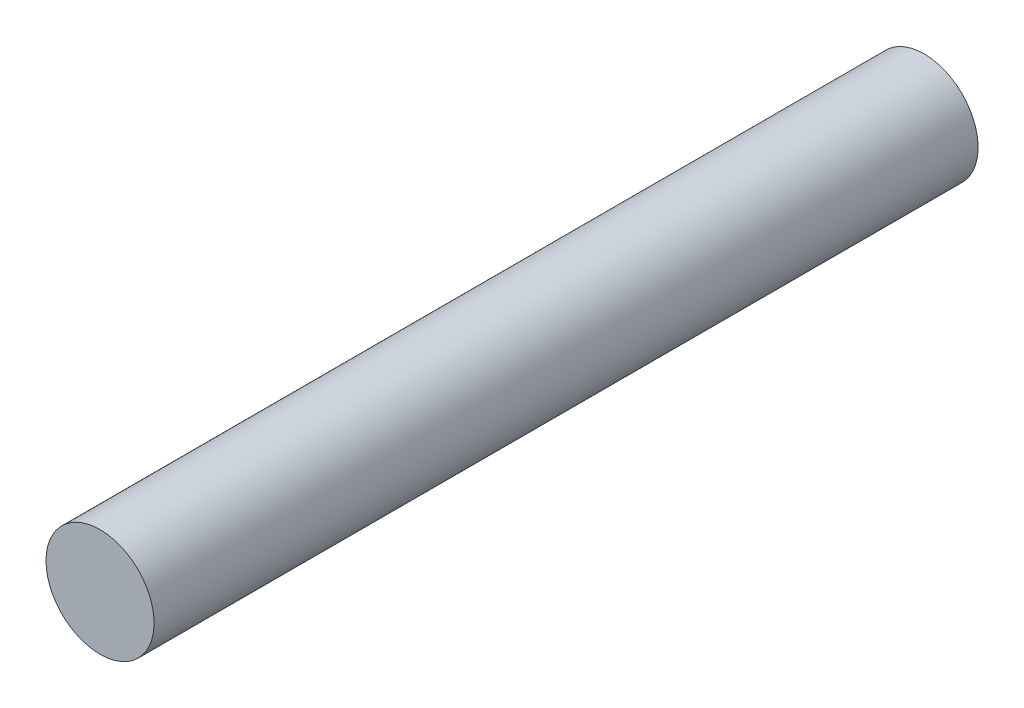
ISO-10303-21;
HEADER;
FILE_DESCRIPTION(('STEP AP214'),'2;1');
FILE_NAME('part.step','',(''),(''),'','','');
FILE_SCHEMA(('AUTOMOTIVE_DESIGN { 1 0 10303 214 1 1 1 1 }'));
ENDSEC;
DATA;
#1=APPLICATION_CONTEXT('core data for automotive mechanical design processes');
#2=APPLICATION_PROTOCOL_DEFINITION('international standard','automotive_design',2000,#1);
#3=PRODUCT_CONTEXT('',#1,'mechanical');
#4=PRODUCT('Part','Part','',(#3));
#5=PRODUCT_RELATED_PRODUCT_CATEGORY('part','',(#4));
#6=PRODUCT_DEFINITION_FORMATION('','',#4);
#7=PRODUCT_DEFINITION_CONTEXT('part definition',#1,'design');
#8=PRODUCT_DEFINITION('design','',#6,#7);
#9=PRODUCT_DEFINITION_SHAPE('','',#8);
#10=(LENGTH_UNIT() NAMED_UNIT(*) SI_UNIT(.MILLI.,.METRE.));
#11=(NAMED_UNIT(*) PLANE_ANGLE_UNIT() SI_UNIT($,.RADIAN.));
#12=(NAMED_UNIT(*) SI_UNIT($,.STERADIAN.) SOLID_ANGLE_UNIT());
#13=UNCERTAINTY_MEASURE_WITH_UNIT(LENGTH_MEASURE(1.E-05),#10,'distance_accuracy_value','');
#14=(GEOMETRIC_REPRESENTATION_CONTEXT(3) GLOBAL_UNCERTAINTY_ASSIGNED_CONTEXT((#13)) GLOBAL_UNIT_ASSIGNED_CONTEXT((#10,
#11,#12)) REPRESENTATION_CONTEXT('',''));
#15=CARTESIAN_POINT('',(0.,0.,0.));
#16=DIRECTION('',(0.,0.,1.));
#17=DIRECTION('',(1.,0.,0.));
#18=AXIS2_PLACEMENT_3D('',#15,#16,#17);
#19=CARTESIAN_POINT('',(0.,0.,61.));
#20=DIRECTION('',(0.,0.,-1.));
#21=DIRECTION('',(-1.,0.,0.));
#22=AXIS2_PLACEMENT_3D('',#19,#20,#21);
#23=CYLINDRICAL_SURFACE('',#22,4.);
#24=CARTESIAN_POINT('',(0.,0.,61.));
#25=DIRECTION('',(0.,0.,1.));
#26=DIRECTION('',(1.,0.,0.));
#27=AXIS2_PLACEMENT_3D('',#24,#25,#26);
#28=CIRCLE('',#27,4.);
#29=CARTESIAN_POINT('',(-4.,0.,61.));
#30=VERTEX_POINT('',#29);
#31=EDGE_CURVE('E10',#30,#30,#28,.T.);
#32=CARTESIAN_POINT('',(0.,0.,0.));
#33=DIRECTION('',(0.,0.,1.));
#34=DIRECTION('',(1.,0.,0.));
#35=AXIS2_PLACEMENT_3D('',#32,#33,#34);
#36=CIRCLE('',#35,4.);
#37=CARTESIAN_POINT('',(-4.,0.,0.));
#38=VERTEX_POINT('',#37);
#39=EDGE_CURVE('E40',#38,#38,#36,.T.);
#40=CARTESIAN_POINT('',(-4.,0.,61.));
#41=CARTESIAN_POINT('',(-4.,0.,60.3645833333333));
#42=CARTESIAN_POINT('',(-4.,0.,59.7291666666667));
#43=CARTESIAN_POINT('',(-4.,0.,58.4583333333333));
#44=CARTESIAN_POINT('',(-4.,0.,57.8229166666667));
#45=CARTESIAN_POINT('',(-4.,0.,56.5520833333333));
#46=CARTESIAN_POINT('',(-4.,0.,55.9166666666667));
#47=CARTESIAN_POINT('',(-4.,0.,54.6458333333333));
#48=CARTESIAN_POINT('',(-4.,0.,54.0104166666667));
#49=CARTESIAN_POINT('',(-4.,0.,52.7395833333333));
#50=CARTESIAN_POINT('',(-4.,0.,52.1041666666667));
#51=CARTESIAN_POINT('',(-4.,0.,50.8333333333333));
#52=CARTESIAN_POINT('',(-4.,0.,50.1979166666667));
#53=CARTESIAN_POINT('',(-4.,0.,48.9270833333333));
#54=CARTESIAN_POINT('',(-4.,0.,48.2916666666667));
#55=CARTESIAN_POINT('',(-4.,0.,47.0208333333333));
#56=CARTESIAN_POINT('',(-4.,0.,46.3854166666667));
#57=CARTESIAN_POINT('',(-4.,0.,45.1145833333333));
#58=CARTESIAN_POINT('',(-4.,0.,44.4791666666667));
#59=CARTESIAN_POINT('',(-4.,0.,43.2083333333333));
#60=CARTESIAN_POINT('',(-4.,0.,42.5729166666667));
#61=CARTESIAN_POINT('',(-4.,0.,41.3020833333333));
#62=CARTESIAN_POINT('',(-4.,0.,40.6666666666667));
#63=CARTESIAN_POINT('',(-4.,0.,39.3958333333333));
#64=CARTESIAN_POINT('',(-4.,0.,38.7604166666667));
#65=CARTESIAN_POINT('',(-4.,0.,37.4895833333333));
#66=CARTESIAN_POINT('',(-4.,0.,36.8541666666667));
#67=CARTESIAN_POINT('',(-4.,0.,35.5833333333333));
#68=CARTESIAN_POINT('',(-4.,0.,34.9479166666667));
#69=CARTESIAN_POINT('',(-4.,0.,33.6770833333333));
#70=CARTESIAN_POINT('',(-4.,0.,33.0416666666667));
#71=CARTESIAN_POINT('',(-4.,0.,31.7708333333333));
#72=CARTESIAN_POINT('',(-4.,0.,31.1354166666667));
#73=CARTESIAN_POINT('',(-4.,0.,29.8645833333333));
#74=CARTESIAN_POINT('',(-4.,0.,29.2291666666667));
#75=CARTESIAN_POINT('',(-4.,0.,27.9583333333333));
#76=CARTESIAN_POINT('',(-4.,0.,27.3229166666667));
#77=CARTESIAN_POINT('',(-4.,0.,26.0520833333333));
#78=CARTESIAN_POINT('',(-4.,0.,25.4166666666667));
#79=CARTESIAN_POINT('',(-4.,0.,24.1458333333333));
#80=CARTESIAN_POINT('',(-4.,0.,23.5104166666667));
#81=CARTESIAN_POINT('',(-4.,0.,22.2395833333333));
#82=CARTESIAN_POINT('',(-4.,0.,21.6041666666667));
#83=CARTESIAN_POINT('',(-4.,0.,20.3333333333333));
#84=CARTESIAN_POINT('',(-4.,0.,19.6979166666667));
#85=CARTESIAN_POINT('',(-4.,0.,18.4270833333333));
#86=CARTESIAN_POINT('',(-4.,0.,17.7916666666667));
#87=CARTESIAN_POINT('',(-4.,0.,16.5208333333333));
#88=CARTESIAN_POINT('',(-4.,0.,15.8854166666667));
#89=CARTESIAN_POINT('',(-4.,0.,14.6145833333333));
#90=CARTESIAN_POINT('',(-4.,0.,13.9791666666667));
#91=CARTESIAN_POINT('',(-4.,0.,12.7083333333333));
#92=CARTESIAN_POINT('',(-4.,0.,12.0729166666667));
#93=CARTESIAN_POINT('',(-4.,0.,10.8020833333333));
#94=CARTESIAN_POINT('',(-4.,0.,10.1666666666667));
#95=CARTESIAN_POINT('',(-4.,0.,8.89583333333333));
#96=CARTESIAN_POINT('',(-4.,0.,8.26041666666666));
#97=CARTESIAN_POINT('',(-4.,0.,6.98958333333333));
#98=CARTESIAN_POINT('',(-4.,0.,6.35416666666666));
#99=CARTESIAN_POINT('',(-4.,0.,5.08333333333333));
#100=CARTESIAN_POINT('',(-4.,0.,4.44791666666666));
#101=CARTESIAN_POINT('',(-4.,0.,3.17708333333333));
#102=CARTESIAN_POINT('',(-4.,0.,2.54166666666666));
#103=CARTESIAN_POINT('',(-4.,0.,1.27083333333332));
#104=CARTESIAN_POINT('',(-4.,0.,0.635416666666658));
#105=CARTESIAN_POINT('',(-4.,0.,0.));
#106=B_SPLINE_CURVE_WITH_KNOTS('',3,(#40,#41,#42,#43,#44,#45,#46,#47,#48,#49,#50,#51,#52,#53,
#54,#55,#56,#57,#58,#59,#60,#61,#62,#63,#64,#65,#66,#67,#68,#69,#70,#71,#72,#73,#74,#75,#76,#77,
#78,#79,#80,#81,#82,#83,#84,#85,#86,#87,#88,#89,#90,#91,#92,#93,#94,#95,#96,#97,#98,#99,#100,
#101,#102,#103,#104,#105),.UNSPECIFIED.,.F.,.F.,(4,2,2,2,2,2,2,2,2,2,2,2,2,2,2,2,2,2,2,2,2,2,2,
2,2,2,2,2,2,2,2,2,4),(0.,1.90625,3.8125,5.71874999999999,7.625,9.53125,11.4375,13.34375,15.25,
17.15625,19.0625,20.96875,22.875,24.78125,26.6875,28.59375,30.5,32.40625,34.3125,36.21875,
38.125,40.03125,41.9375,43.84375,45.75,47.65625,49.5625,51.46875,53.375,55.28125,57.1875,
59.09375,61.),.UNSPECIFIED.);
#107=EDGE_CURVE('BSEAM37',#30,#38,#106,.T.);
#108=ORIENTED_EDGE('',*,*,#31,.F.);
#109=ORIENTED_EDGE('',*,*,#39,.T.);
#110=ORIENTED_EDGE('',*,*,#107,.T.);
#111=ORIENTED_EDGE('',*,*,#107,.F.);
#112=EDGE_LOOP('',(#108,#110,#109,#111));
#113=FACE_BOUND('',#112,.T.);
#114=ADVANCED_FACE('F37',(#113),#23,.T.);
#115=CARTESIAN_POINT('',(0.,0.,61.));
#116=DIRECTION('',(0.,0.,1.));
#117=DIRECTION('',(1.,0.,0.));
#118=AXIS2_PLACEMENT_3D('',#115,#116,#117);
#119=PLANE('',#118);
#120=ORIENTED_EDGE('',*,*,#31,.T.);
#121=EDGE_LOOP('',(#120));
#122=FACE_BOUND('',#121,.T.);
#123=ADVANCED_FACE('F52',(#122),#119,.T.);
#124=CARTESIAN_POINT('',(0.,0.,0.));
#125=DIRECTION('',(0.,0.,1.));
#126=DIRECTION('',(1.,0.,0.));
#127=AXIS2_PLACEMENT_3D('',#124,#125,#126);
#128=PLANE('',#127);
#129=ORIENTED_EDGE('',*,*,#39,.F.);
#130=EDGE_LOOP('',(#129));
#131=FACE_BOUND('',#130,.T.);
#132=ADVANCED_FACE('F50',(#131),#128,.F.);
#133=CLOSED_SHELL('',(#114,#123,#132));
#134=MANIFOLD_SOLID_BREP('B2',#133);
#135=ADVANCED_BREP_SHAPE_REPRESENTATION('',(#18,#134),#14);
#136=SHAPE_DEFINITION_REPRESENTATION(#9,#135);
ENDSEC;
END-ISO-10303-21;
